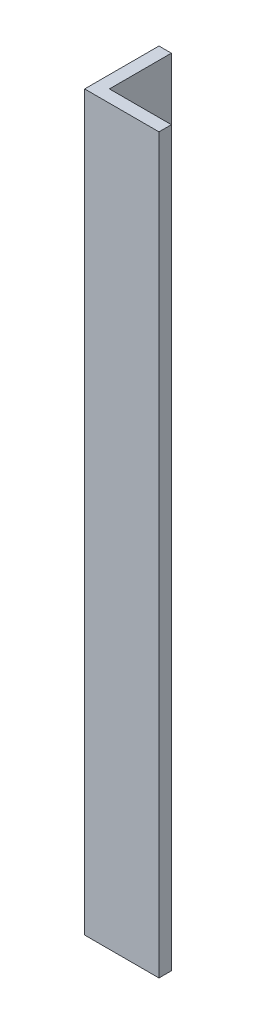
ISO-10303-21;
HEADER;
FILE_DESCRIPTION(('STEP AP214'),'2;1');
FILE_NAME('part.step','',(''),(''),'','','');
FILE_SCHEMA(('AUTOMOTIVE_DESIGN { 1 0 10303 214 1 1 1 1 }'));
ENDSEC;
DATA;
#1=APPLICATION_CONTEXT('core data for automotive mechanical design processes');
#2=APPLICATION_PROTOCOL_DEFINITION('international standard','automotive_design',2000,#1);
#3=PRODUCT_CONTEXT('',#1,'mechanical');
#4=PRODUCT('Part','Part','',(#3));
#5=PRODUCT_RELATED_PRODUCT_CATEGORY('part','',(#4));
#6=PRODUCT_DEFINITION_FORMATION('','',#4);
#7=PRODUCT_DEFINITION_CONTEXT('part definition',#1,'design');
#8=PRODUCT_DEFINITION('design','',#6,#7);
#9=PRODUCT_DEFINITION_SHAPE('','',#8);
#10=(LENGTH_UNIT() NAMED_UNIT(*) SI_UNIT(.MILLI.,.METRE.));
#11=(NAMED_UNIT(*) PLANE_ANGLE_UNIT() SI_UNIT($,.RADIAN.));
#12=(NAMED_UNIT(*) SI_UNIT($,.STERADIAN.) SOLID_ANGLE_UNIT());
#13=UNCERTAINTY_MEASURE_WITH_UNIT(LENGTH_MEASURE(1.E-05),#10,'distance_accuracy_value','');
#14=(GEOMETRIC_REPRESENTATION_CONTEXT(3) GLOBAL_UNCERTAINTY_ASSIGNED_CONTEXT((#13)) GLOBAL_UNIT_ASSIGNED_CONTEXT((#10,
#11,#12)) REPRESENTATION_CONTEXT('',''));
#15=CARTESIAN_POINT('',(0.,0.,0.));
#16=DIRECTION('',(0.,0.,1.));
#17=DIRECTION('',(1.,0.,0.));
#18=AXIS2_PLACEMENT_3D('',#15,#16,#17);
#19=CARTESIAN_POINT('',(0.,93.901290125,-19.05));
#20=DIRECTION('',(1.,0.,0.));
#21=DIRECTION('',(0.,0.,-1.));
#22=AXIS2_PLACEMENT_3D('',#19,#20,#21);
#23=PLANE('',#22);
#24=DIRECTION('',(0.,0.,1.));
#25=VECTOR('',#24,1.);
#26=CARTESIAN_POINT('',(0.,-93.901290125,-19.05));
#27=LINE('',#26,#25);
#28=CARTESIAN_POINT('',(0.,-93.901290125,-19.05));
#29=VERTEX_POINT('',#28);
#30=CARTESIAN_POINT('',(0.,-93.901290125,0.));
#31=VERTEX_POINT('',#30);
#32=EDGE_CURVE('E121',#29,#31,#27,.T.);
#33=ORIENTED_EDGE('',*,*,#32,.T.);
#34=DIRECTION('',(0.,-1.,0.));
#35=VECTOR('',#34,1.);
#36=CARTESIAN_POINT('',(0.,93.901290125,0.));
#37=LINE('',#36,#35);
#38=CARTESIAN_POINT('',(0.,93.901290125,0.));
#39=VERTEX_POINT('',#38);
#40=EDGE_CURVE('E11',#39,#31,#37,.T.);
#41=ORIENTED_EDGE('',*,*,#40,.F.);
#42=DIRECTION('',(0.,0.,1.));
#43=VECTOR('',#42,1.);
#44=CARTESIAN_POINT('',(0.,93.901290125,-19.05));
#45=LINE('',#44,#43);
#46=CARTESIAN_POINT('',(0.,93.901290125,-19.05));
#47=VERTEX_POINT('',#46);
#48=EDGE_CURVE('E131',#47,#39,#45,.T.);
#49=ORIENTED_EDGE('',*,*,#48,.F.);
#50=DIRECTION('',(0.,-1.,0.));
#51=VECTOR('',#50,1.);
#52=CARTESIAN_POINT('',(0.,93.901290125,-19.05));
#53=LINE('',#52,#51);
#54=EDGE_CURVE('E117',#47,#29,#53,.T.);
#55=ORIENTED_EDGE('',*,*,#54,.T.);
#56=EDGE_LOOP('',(#33,#41,#49,#55));
#57=FACE_BOUND('',#56,.T.);
#58=ADVANCED_FACE('F37',(#57),#23,.F.);
#59=CARTESIAN_POINT('',(0.,93.901290125,0.));
#60=DIRECTION('',(0.,0.,-1.));
#61=DIRECTION('',(-1.,0.,0.));
#62=AXIS2_PLACEMENT_3D('',#59,#60,#61);
#63=PLANE('',#62);
#64=DIRECTION('',(1.,0.,0.));
#65=VECTOR('',#64,1.);
#66=CARTESIAN_POINT('',(0.,-93.901290125,0.));
#67=LINE('',#66,#65);
#68=CARTESIAN_POINT('',(19.05,-93.901290125,0.));
#69=VERTEX_POINT('',#68);
#70=EDGE_CURVE('E124',#31,#69,#67,.T.);
#71=ORIENTED_EDGE('',*,*,#70,.T.);
#72=DIRECTION('',(0.,-1.,0.));
#73=VECTOR('',#72,1.);
#74=CARTESIAN_POINT('',(19.05,93.901290125,0.));
#75=LINE('',#74,#73);
#76=CARTESIAN_POINT('',(19.05,93.901290125,0.));
#77=VERTEX_POINT('',#76);
#78=EDGE_CURVE('E45',#77,#69,#75,.T.);
#79=ORIENTED_EDGE('',*,*,#78,.F.);
#80=DIRECTION('',(1.,0.,0.));
#81=VECTOR('',#80,1.);
#82=CARTESIAN_POINT('',(0.,93.901290125,0.));
#83=LINE('',#82,#81);
#84=EDGE_CURVE('E90',#39,#77,#83,.T.);
#85=ORIENTED_EDGE('',*,*,#84,.F.);
#86=ORIENTED_EDGE('',*,*,#40,.T.);
#87=EDGE_LOOP('',(#71,#79,#85,#86));
#88=FACE_BOUND('',#87,.T.);
#89=ADVANCED_FACE('F155',(#88),#63,.F.);
#90=CARTESIAN_POINT('',(19.05,93.901290125,0.));
#91=DIRECTION('',(-1.,0.,0.));
#92=DIRECTION('',(0.,0.,1.));
#93=AXIS2_PLACEMENT_3D('',#90,#91,#92);
#94=PLANE('',#93);
#95=DIRECTION('',(0.,0.,-1.));
#96=VECTOR('',#95,1.);
#97=CARTESIAN_POINT('',(19.05,-93.901290125,0.));
#98=LINE('',#97,#96);
#99=CARTESIAN_POINT('',(19.05,-93.901290125,-3.175));
#100=VERTEX_POINT('',#99);
#101=EDGE_CURVE('E126',#69,#100,#98,.T.);
#102=ORIENTED_EDGE('',*,*,#101,.T.);
#103=DIRECTION('',(0.,-1.,0.));
#104=VECTOR('',#103,1.);
#105=CARTESIAN_POINT('',(19.05,93.901290125,-3.175));
#106=LINE('',#105,#104);
#107=CARTESIAN_POINT('',(19.05,93.901290125,-3.175));
#108=VERTEX_POINT('',#107);
#109=EDGE_CURVE('E112',#108,#100,#106,.T.);
#110=ORIENTED_EDGE('',*,*,#109,.F.);
#111=DIRECTION('',(0.,0.,-1.));
#112=VECTOR('',#111,1.);
#113=CARTESIAN_POINT('',(19.05,93.901290125,0.));
#114=LINE('',#113,#112);
#115=EDGE_CURVE('E103',#77,#108,#114,.T.);
#116=ORIENTED_EDGE('',*,*,#115,.F.);
#117=ORIENTED_EDGE('',*,*,#78,.T.);
#118=EDGE_LOOP('',(#102,#110,#116,#117));
#119=FACE_BOUND('',#118,.T.);
#120=ADVANCED_FACE('F137',(#119),#94,.F.);
#121=CARTESIAN_POINT('',(19.05,93.901290125,-3.175));
#122=DIRECTION('',(0.,0.,1.));
#123=DIRECTION('',(1.,0.,0.));
#124=AXIS2_PLACEMENT_3D('',#121,#122,#123);
#125=PLANE('',#124);
#126=DIRECTION('',(-1.,0.,0.));
#127=VECTOR('',#126,1.);
#128=CARTESIAN_POINT('',(19.05,-93.901290125,-3.175));
#129=LINE('',#128,#127);
#130=CARTESIAN_POINT('',(3.175,-93.901290125,-3.175));
#131=VERTEX_POINT('',#130);
#132=EDGE_CURVE('E111',#100,#131,#129,.T.);
#133=ORIENTED_EDGE('',*,*,#132,.T.);
#134=DIRECTION('',(0.,-1.,0.));
#135=VECTOR('',#134,1.);
#136=CARTESIAN_POINT('',(3.175,93.901290125,-3.175));
#137=LINE('',#136,#135);
#138=CARTESIAN_POINT('',(3.175,93.901290125,-3.175));
#139=VERTEX_POINT('',#138);
#140=EDGE_CURVE('E108',#139,#131,#137,.T.);
#141=ORIENTED_EDGE('',*,*,#140,.F.);
#142=DIRECTION('',(-1.,0.,0.));
#143=VECTOR('',#142,1.);
#144=CARTESIAN_POINT('',(19.05,93.901290125,-3.175));
#145=LINE('',#144,#143);
#146=EDGE_CURVE('E97',#108,#139,#145,.T.);
#147=ORIENTED_EDGE('',*,*,#146,.F.);
#148=ORIENTED_EDGE('',*,*,#109,.T.);
#149=EDGE_LOOP('',(#133,#141,#147,#148));
#150=FACE_BOUND('',#149,.T.);
#151=ADVANCED_FACE('F109',(#150),#125,.F.);
#152=CARTESIAN_POINT('',(3.175,93.901290125,-3.175));
#153=DIRECTION('',(-1.,0.,0.));
#154=DIRECTION('',(0.,0.,1.));
#155=AXIS2_PLACEMENT_3D('',#152,#153,#154);
#156=PLANE('',#155);
#157=DIRECTION('',(0.,0.,-1.));
#158=VECTOR('',#157,1.);
#159=CARTESIAN_POINT('',(3.175,-93.901290125,-3.175));
#160=LINE('',#159,#158);
#161=CARTESIAN_POINT('',(3.175,-93.901290125,-19.05));
#162=VERTEX_POINT('',#161);
#163=EDGE_CURVE('E76',#131,#162,#160,.T.);
#164=ORIENTED_EDGE('',*,*,#163,.T.);
#165=DIRECTION('',(0.,-1.,0.));
#166=VECTOR('',#165,1.);
#167=CARTESIAN_POINT('',(3.175,93.901290125,-19.05));
#168=LINE('',#167,#166);
#169=CARTESIAN_POINT('',(3.175,93.901290125,-19.05));
#170=VERTEX_POINT('',#169);
#171=EDGE_CURVE('E113',#170,#162,#168,.T.);
#172=ORIENTED_EDGE('',*,*,#171,.F.);
#173=DIRECTION('',(0.,0.,-1.));
#174=VECTOR('',#173,1.);
#175=CARTESIAN_POINT('',(3.175,93.901290125,-3.175));
#176=LINE('',#175,#174);
#177=EDGE_CURVE('E101',#139,#170,#176,.T.);
#178=ORIENTED_EDGE('',*,*,#177,.F.);
#179=ORIENTED_EDGE('',*,*,#140,.T.);
#180=EDGE_LOOP('',(#164,#172,#178,#179));
#181=FACE_BOUND('',#180,.T.);
#182=ADVANCED_FACE('F115',(#181),#156,.F.);
#183=CARTESIAN_POINT('',(3.175,93.901290125,-19.05));
#184=DIRECTION('',(0.,0.,1.));
#185=DIRECTION('',(1.,0.,0.));
#186=AXIS2_PLACEMENT_3D('',#183,#184,#185);
#187=PLANE('',#186);
#188=DIRECTION('',(-1.,0.,0.));
#189=VECTOR('',#188,1.);
#190=CARTESIAN_POINT('',(3.175,-93.901290125,-19.05));
#191=LINE('',#190,#189);
#192=EDGE_CURVE('E82',#162,#29,#191,.T.);
#193=ORIENTED_EDGE('',*,*,#192,.T.);
#194=ORIENTED_EDGE('',*,*,#54,.F.);
#195=DIRECTION('',(-1.,0.,0.));
#196=VECTOR('',#195,1.);
#197=CARTESIAN_POINT('',(3.175,93.901290125,-19.05));
#198=LINE('',#197,#196);
#199=EDGE_CURVE('E53',#170,#47,#198,.T.);
#200=ORIENTED_EDGE('',*,*,#199,.F.);
#201=ORIENTED_EDGE('',*,*,#171,.T.);
#202=EDGE_LOOP('',(#193,#194,#200,#201));
#203=FACE_BOUND('',#202,.T.);
#204=ADVANCED_FACE('F144',(#203),#187,.F.);
#205=CARTESIAN_POINT('',(0.,93.901290125,0.));
#206=DIRECTION('',(0.,1.,0.));
#207=DIRECTION('',(0.,0.,1.));
#208=AXIS2_PLACEMENT_3D('',#205,#206,#207);
#209=PLANE('',#208);
#210=ORIENTED_EDGE('',*,*,#48,.T.);
#211=ORIENTED_EDGE('',*,*,#84,.T.);
#212=ORIENTED_EDGE('',*,*,#115,.T.);
#213=ORIENTED_EDGE('',*,*,#146,.T.);
#214=ORIENTED_EDGE('',*,*,#177,.T.);
#215=ORIENTED_EDGE('',*,*,#199,.T.);
#216=EDGE_LOOP('',(#210,#211,#212,#213,#214,#215));
#217=FACE_BOUND('',#216,.T.);
#218=ADVANCED_FACE('F99',(#217),#209,.T.);
#219=CARTESIAN_POINT('',(0.,-93.901290125,0.));
#220=DIRECTION('',(0.,1.,0.));
#221=DIRECTION('',(0.,0.,1.));
#222=AXIS2_PLACEMENT_3D('',#219,#220,#221);
#223=PLANE('',#222);
#224=ORIENTED_EDGE('',*,*,#32,.F.);
#225=ORIENTED_EDGE('',*,*,#192,.F.);
#226=ORIENTED_EDGE('',*,*,#163,.F.);
#227=ORIENTED_EDGE('',*,*,#132,.F.);
#228=ORIENTED_EDGE('',*,*,#101,.F.);
#229=ORIENTED_EDGE('',*,*,#70,.F.);
#230=EDGE_LOOP('',(#224,#225,#226,#227,#228,#229));
#231=FACE_BOUND('',#230,.T.);
#232=ADVANCED_FACE('F140',(#231),#223,.F.);
#233=CLOSED_SHELL('',(#58,#89,#120,#151,#182,#204,#218,#232));
#234=MANIFOLD_SOLID_BREP('B2',#233);
#235=ADVANCED_BREP_SHAPE_REPRESENTATION('',(#18,#234),#14);
#236=SHAPE_DEFINITION_REPRESENTATION(#9,#235);
ENDSEC;
END-ISO-10303-21;
